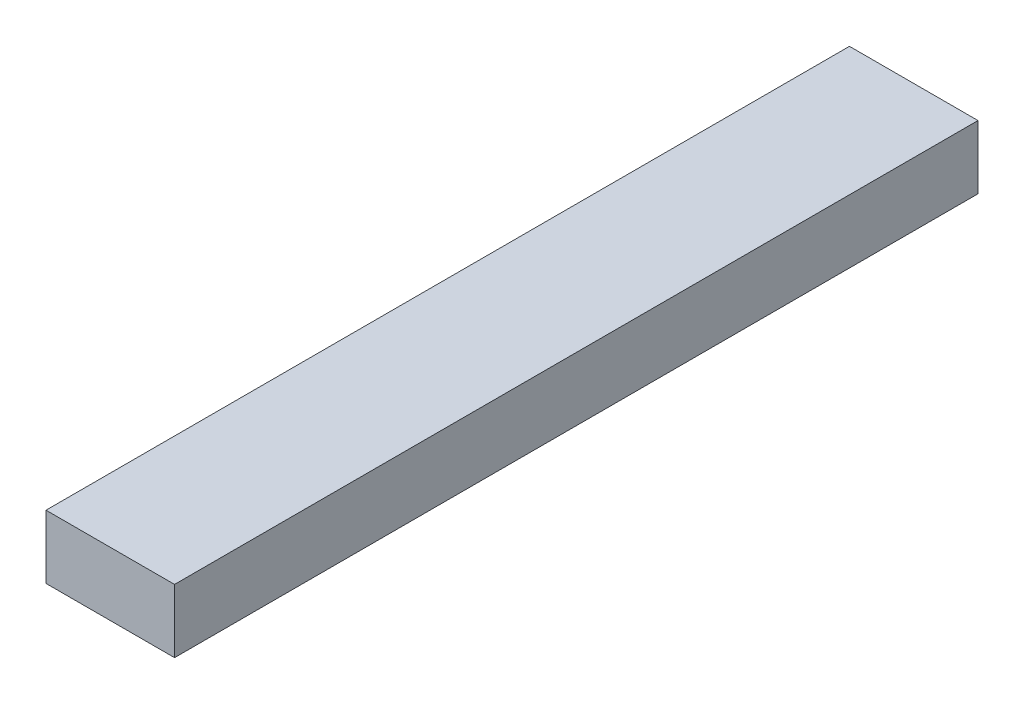
ISO-10303-21;
HEADER;
FILE_DESCRIPTION(('STEP AP214'),'2;1');
FILE_NAME('part.step','',(''),(''),'','','');
FILE_SCHEMA(('AUTOMOTIVE_DESIGN { 1 0 10303 214 1 1 1 1 }'));
ENDSEC;
DATA;
#1=APPLICATION_CONTEXT('core data for automotive mechanical design processes');
#2=APPLICATION_PROTOCOL_DEFINITION('international standard','automotive_design',2000,#1);
#3=PRODUCT_CONTEXT('',#1,'mechanical');
#4=PRODUCT('Part','Part','',(#3));
#5=PRODUCT_RELATED_PRODUCT_CATEGORY('part','',(#4));
#6=PRODUCT_DEFINITION_FORMATION('','',#4);
#7=PRODUCT_DEFINITION_CONTEXT('part definition',#1,'design');
#8=PRODUCT_DEFINITION('design','',#6,#7);
#9=PRODUCT_DEFINITION_SHAPE('','',#8);
#10=(LENGTH_UNIT() NAMED_UNIT(*) SI_UNIT(.MILLI.,.METRE.));
#11=(NAMED_UNIT(*) PLANE_ANGLE_UNIT() SI_UNIT($,.RADIAN.));
#12=(NAMED_UNIT(*) SI_UNIT($,.STERADIAN.) SOLID_ANGLE_UNIT());
#13=UNCERTAINTY_MEASURE_WITH_UNIT(LENGTH_MEASURE(1.E-05),#10,'distance_accuracy_value','');
#14=(GEOMETRIC_REPRESENTATION_CONTEXT(3) GLOBAL_UNCERTAINTY_ASSIGNED_CONTEXT((#13)) GLOBAL_UNIT_ASSIGNED_CONTEXT((#10,
#11,#12)) REPRESENTATION_CONTEXT('',''));
#15=CARTESIAN_POINT('',(0.,0.,0.));
#16=DIRECTION('',(0.,0.,1.));
#17=DIRECTION('',(1.,0.,0.));
#18=AXIS2_PLACEMENT_3D('',#15,#16,#17);
#19=CARTESIAN_POINT('',(4.72,-2.33,59.));
#20=DIRECTION('',(-1.,0.,0.));
#21=DIRECTION('',(0.,0.,1.));
#22=AXIS2_PLACEMENT_3D('',#19,#20,#21);
#23=PLANE('',#22);
#24=DIRECTION('',(0.,1.,0.));
#25=VECTOR('',#24,1.);
#26=CARTESIAN_POINT('',(4.72,-2.33,0.));
#27=LINE('',#26,#25);
#28=CARTESIAN_POINT('',(4.72,-2.33,0.));
#29=VERTEX_POINT('',#28);
#30=CARTESIAN_POINT('',(4.72,2.33,0.));
#31=VERTEX_POINT('',#30);
#32=EDGE_CURVE('E96',#29,#31,#27,.T.);
#33=ORIENTED_EDGE('',*,*,#32,.T.);
#34=DIRECTION('',(0.,0.,-1.));
#35=VECTOR('',#34,1.);
#36=CARTESIAN_POINT('',(4.72,2.33,59.));
#37=LINE('',#36,#35);
#38=CARTESIAN_POINT('',(4.72,2.33,59.));
#39=VERTEX_POINT('',#38);
#40=EDGE_CURVE('E11',#39,#31,#37,.T.);
#41=ORIENTED_EDGE('',*,*,#40,.F.);
#42=DIRECTION('',(0.,1.,0.));
#43=VECTOR('',#42,1.);
#44=CARTESIAN_POINT('',(4.72,-2.33,59.));
#45=LINE('',#44,#43);
#46=CARTESIAN_POINT('',(4.72,-2.33,59.));
#47=VERTEX_POINT('',#46);
#48=EDGE_CURVE('E84',#47,#39,#45,.T.);
#49=ORIENTED_EDGE('',*,*,#48,.F.);
#50=DIRECTION('',(0.,0.,-1.));
#51=VECTOR('',#50,1.);
#52=CARTESIAN_POINT('',(4.72,-2.33,59.));
#53=LINE('',#52,#51);
#54=EDGE_CURVE('E92',#47,#29,#53,.T.);
#55=ORIENTED_EDGE('',*,*,#54,.T.);
#56=EDGE_LOOP('',(#33,#41,#49,#55));
#57=FACE_BOUND('',#56,.T.);
#58=ADVANCED_FACE('F33',(#57),#23,.F.);
#59=CARTESIAN_POINT('',(-4.72,2.33,59.));
#60=DIRECTION('',(0.,-1.,0.));
#61=DIRECTION('',(0.,0.,-1.));
#62=AXIS2_PLACEMENT_3D('',#59,#60,#61);
#63=PLANE('',#62);
#64=DIRECTION('',(-1.,0.,0.));
#65=VECTOR('',#64,1.);
#66=CARTESIAN_POINT('',(-4.72,2.33,0.));
#67=LINE('',#66,#65);
#68=CARTESIAN_POINT('',(-4.72,2.33,0.));
#69=VERTEX_POINT('',#68);
#70=EDGE_CURVE('E88',#31,#69,#67,.T.);
#71=ORIENTED_EDGE('',*,*,#70,.T.);
#72=DIRECTION('',(0.,0.,-1.));
#73=VECTOR('',#72,1.);
#74=CARTESIAN_POINT('',(-4.72,2.33,59.));
#75=LINE('',#74,#73);
#76=CARTESIAN_POINT('',(-4.72,2.33,59.));
#77=VERTEX_POINT('',#76);
#78=EDGE_CURVE('E41',#77,#69,#75,.T.);
#79=ORIENTED_EDGE('',*,*,#78,.F.);
#80=DIRECTION('',(-1.,0.,0.));
#81=VECTOR('',#80,1.);
#82=CARTESIAN_POINT('',(-4.72,2.33,59.));
#83=LINE('',#82,#81);
#84=EDGE_CURVE('E79',#39,#77,#83,.T.);
#85=ORIENTED_EDGE('',*,*,#84,.F.);
#86=ORIENTED_EDGE('',*,*,#40,.T.);
#87=EDGE_LOOP('',(#71,#79,#85,#86));
#88=FACE_BOUND('',#87,.T.);
#89=ADVANCED_FACE('F87',(#88),#63,.F.);
#90=CARTESIAN_POINT('',(-4.72,-2.33,59.));
#91=DIRECTION('',(1.,0.,0.));
#92=DIRECTION('',(0.,0.,-1.));
#93=AXIS2_PLACEMENT_3D('',#90,#91,#92);
#94=PLANE('',#93);
#95=DIRECTION('',(0.,-1.,0.));
#96=VECTOR('',#95,1.);
#97=CARTESIAN_POINT('',(-4.72,-2.33,0.));
#98=LINE('',#97,#96);
#99=CARTESIAN_POINT('',(-4.72,-2.33,0.));
#100=VERTEX_POINT('',#99);
#101=EDGE_CURVE('E66',#69,#100,#98,.T.);
#102=ORIENTED_EDGE('',*,*,#101,.T.);
#103=DIRECTION('',(0.,0.,-1.));
#104=VECTOR('',#103,1.);
#105=CARTESIAN_POINT('',(-4.72,-2.33,59.));
#106=LINE('',#105,#104);
#107=CARTESIAN_POINT('',(-4.72,-2.33,59.));
#108=VERTEX_POINT('',#107);
#109=EDGE_CURVE('E89',#108,#100,#106,.T.);
#110=ORIENTED_EDGE('',*,*,#109,.F.);
#111=DIRECTION('',(0.,-1.,0.));
#112=VECTOR('',#111,1.);
#113=CARTESIAN_POINT('',(-4.72,-2.33,59.));
#114=LINE('',#113,#112);
#115=EDGE_CURVE('E82',#77,#108,#114,.T.);
#116=ORIENTED_EDGE('',*,*,#115,.F.);
#117=ORIENTED_EDGE('',*,*,#78,.T.);
#118=EDGE_LOOP('',(#102,#110,#116,#117));
#119=FACE_BOUND('',#118,.T.);
#120=ADVANCED_FACE('F90',(#119),#94,.F.);
#121=CARTESIAN_POINT('',(-4.72,-2.33,59.));
#122=DIRECTION('',(0.,1.,0.));
#123=DIRECTION('',(0.,0.,1.));
#124=AXIS2_PLACEMENT_3D('',#121,#122,#123);
#125=PLANE('',#124);
#126=DIRECTION('',(1.,0.,0.));
#127=VECTOR('',#126,1.);
#128=CARTESIAN_POINT('',(-4.72,-2.33,0.));
#129=LINE('',#128,#127);
#130=EDGE_CURVE('E72',#100,#29,#129,.T.);
#131=ORIENTED_EDGE('',*,*,#130,.T.);
#132=ORIENTED_EDGE('',*,*,#54,.F.);
#133=DIRECTION('',(1.,0.,0.));
#134=VECTOR('',#133,1.);
#135=CARTESIAN_POINT('',(-4.72,-2.33,59.));
#136=LINE('',#135,#134);
#137=EDGE_CURVE('E49',#108,#47,#136,.T.);
#138=ORIENTED_EDGE('',*,*,#137,.F.);
#139=ORIENTED_EDGE('',*,*,#109,.T.);
#140=EDGE_LOOP('',(#131,#132,#138,#139));
#141=FACE_BOUND('',#140,.T.);
#142=ADVANCED_FACE('F103',(#141),#125,.F.);
#143=CARTESIAN_POINT('',(0.,0.,59.));
#144=DIRECTION('',(0.,0.,-1.));
#145=DIRECTION('',(-1.,0.,0.));
#146=AXIS2_PLACEMENT_3D('',#143,#144,#145);
#147=PLANE('',#146);
#148=ORIENTED_EDGE('',*,*,#48,.T.);
#149=ORIENTED_EDGE('',*,*,#84,.T.);
#150=ORIENTED_EDGE('',*,*,#115,.T.);
#151=ORIENTED_EDGE('',*,*,#137,.T.);
#152=EDGE_LOOP('',(#148,#149,#150,#151));
#153=FACE_BOUND('',#152,.T.);
#154=ADVANCED_FACE('F80',(#153),#147,.F.);
#155=CARTESIAN_POINT('',(0.,0.,0.));
#156=DIRECTION('',(0.,0.,-1.));
#157=DIRECTION('',(-1.,0.,0.));
#158=AXIS2_PLACEMENT_3D('',#155,#156,#157);
#159=PLANE('',#158);
#160=ORIENTED_EDGE('',*,*,#32,.F.);
#161=ORIENTED_EDGE('',*,*,#130,.F.);
#162=ORIENTED_EDGE('',*,*,#101,.F.);
#163=ORIENTED_EDGE('',*,*,#70,.F.);
#164=EDGE_LOOP('',(#160,#161,#162,#163));
#165=FACE_BOUND('',#164,.T.);
#166=ADVANCED_FACE('F106',(#165),#159,.T.);
#167=CLOSED_SHELL('',(#58,#89,#120,#142,#154,#166));
#168=MANIFOLD_SOLID_BREP('B2',#167);
#169=ADVANCED_BREP_SHAPE_REPRESENTATION('',(#18,#168),#14);
#170=SHAPE_DEFINITION_REPRESENTATION(#9,#169);
ENDSEC;
END-ISO-10303-21;
